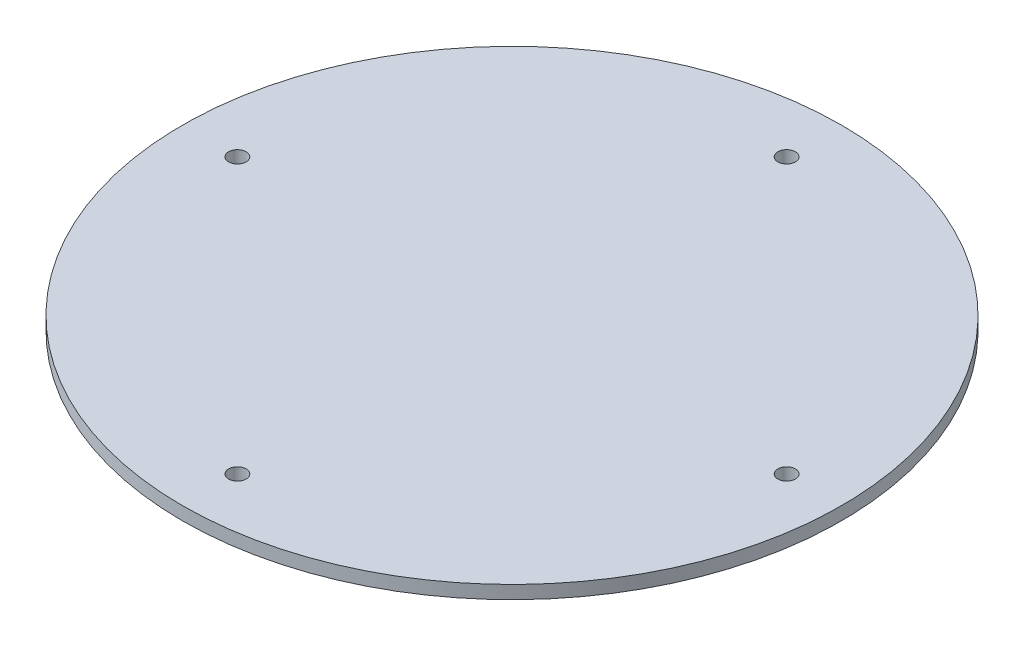
ISO-10303-21;
HEADER;
FILE_DESCRIPTION(('STEP AP214'),'2;1');
FILE_NAME('part.step','',(''),(''),'','','');
FILE_SCHEMA(('AUTOMOTIVE_DESIGN { 1 0 10303 214 1 1 1 1 }'));
ENDSEC;
DATA;
#1=APPLICATION_CONTEXT('core data for automotive mechanical design processes');
#2=APPLICATION_PROTOCOL_DEFINITION('international standard','automotive_design',2000,#1);
#3=PRODUCT_CONTEXT('',#1,'mechanical');
#4=PRODUCT('Part','Part','',(#3));
#5=PRODUCT_RELATED_PRODUCT_CATEGORY('part','',(#4));
#6=PRODUCT_DEFINITION_FORMATION('','',#4);
#7=PRODUCT_DEFINITION_CONTEXT('part definition',#1,'design');
#8=PRODUCT_DEFINITION('design','',#6,#7);
#9=PRODUCT_DEFINITION_SHAPE('','',#8);
#10=(LENGTH_UNIT() NAMED_UNIT(*) SI_UNIT(.MILLI.,.METRE.));
#11=(NAMED_UNIT(*) PLANE_ANGLE_UNIT() SI_UNIT($,.RADIAN.));
#12=(NAMED_UNIT(*) SI_UNIT($,.STERADIAN.) SOLID_ANGLE_UNIT());
#13=UNCERTAINTY_MEASURE_WITH_UNIT(LENGTH_MEASURE(1.E-05),#10,'distance_accuracy_value','');
#14=(GEOMETRIC_REPRESENTATION_CONTEXT(3) GLOBAL_UNCERTAINTY_ASSIGNED_CONTEXT((#13)) GLOBAL_UNIT_ASSIGNED_CONTEXT((#10,
#11,#12)) REPRESENTATION_CONTEXT('',''));
#15=CARTESIAN_POINT('',(0.,0.,0.));
#16=DIRECTION('',(0.,0.,1.));
#17=DIRECTION('',(1.,0.,0.));
#18=AXIS2_PLACEMENT_3D('',#15,#16,#17);
#19=CARTESIAN_POINT('',(0.,3.,0.));
#20=DIRECTION('',(0.,1.,0.));
#21=DIRECTION('',(0.,0.,1.));
#22=AXIS2_PLACEMENT_3D('',#19,#20,#21);
#23=PLANE('',#22);
#24=CARTESIAN_POINT('',(3.52975155131649E-12,3.,62.5));
#25=DIRECTION('',(0.,1.,0.));
#26=DIRECTION('',(0.,0.,1.));
#27=AXIS2_PLACEMENT_3D('',#24,#25,#26);
#28=CIRCLE('',#27,2.00000000000379);
#29=CARTESIAN_POINT('',(3.52975155131649E-12,3.,64.5000000000038));
#30=VERTEX_POINT('',#29);
#31=EDGE_CURVE('E65',#30,#30,#28,.T.);
#32=ORIENTED_EDGE('',*,*,#31,.F.);
#33=EDGE_LOOP('',(#32));
#34=FACE_BOUND('',#33,.T.);
#35=CARTESIAN_POINT('',(0.,3.,-62.5));
#36=DIRECTION('',(0.,1.,0.));
#37=DIRECTION('',(0.,0.,1.));
#38=AXIS2_PLACEMENT_3D('',#35,#36,#37);
#39=CIRCLE('',#38,2.);
#40=CARTESIAN_POINT('',(0.,3.,-60.5));
#41=VERTEX_POINT('',#40);
#42=EDGE_CURVE('E51',#41,#41,#39,.T.);
#43=ORIENTED_EDGE('',*,*,#42,.F.);
#44=EDGE_LOOP('',(#43));
#45=FACE_BOUND('',#44,.T.);
#46=CARTESIAN_POINT('',(0.,3.,0.));
#47=DIRECTION('',(0.,1.,0.));
#48=DIRECTION('',(0.,0.,1.));
#49=AXIS2_PLACEMENT_3D('',#46,#47,#48);
#50=CIRCLE('',#49,75.);
#51=CARTESIAN_POINT('',(0.,3.,75.));
#52=VERTEX_POINT('',#51);
#53=EDGE_CURVE('E10',#52,#52,#50,.T.);
#54=ORIENTED_EDGE('',*,*,#53,.T.);
#55=EDGE_LOOP('',(#54));
#56=FACE_BOUND('',#55,.T.);
#57=CARTESIAN_POINT('',(62.5000000000018,3.,-1.76487577565824E-12));
#58=DIRECTION('',(0.,1.,0.));
#59=DIRECTION('',(0.,0.,1.));
#60=AXIS2_PLACEMENT_3D('',#57,#58,#59);
#61=CIRCLE('',#60,2.00000000000138);
#62=CARTESIAN_POINT('',(62.5000000000018,3.,1.99999999999961));
#63=VERTEX_POINT('',#62);
#64=EDGE_CURVE('E57',#63,#63,#61,.T.);
#65=ORIENTED_EDGE('',*,*,#64,.F.);
#66=EDGE_LOOP('',(#65));
#67=FACE_BOUND('',#66,.T.);
#68=CARTESIAN_POINT('',(-62.4999999999982,3.,1.77252981815291E-12));
#69=DIRECTION('',(0.,1.,0.));
#70=DIRECTION('',(0.,0.,1.));
#71=AXIS2_PLACEMENT_3D('',#68,#69,#70);
#72=CIRCLE('',#71,2.00000000000284);
#73=CARTESIAN_POINT('',(-62.4999999999982,3.,2.00000000000461));
#74=VERTEX_POINT('',#73);
#75=EDGE_CURVE('E73',#74,#74,#72,.T.);
#76=ORIENTED_EDGE('',*,*,#75,.F.);
#77=EDGE_LOOP('',(#76));
#78=FACE_BOUND('',#77,.T.);
#79=ADVANCED_FACE('F38',(#34,#45,#56,#67,#78),#23,.T.);
#80=CARTESIAN_POINT('',(0.,0.,0.));
#81=DIRECTION('',(0.,1.,0.));
#82=DIRECTION('',(0.,0.,1.));
#83=AXIS2_PLACEMENT_3D('',#80,#81,#82);
#84=PLANE('',#83);
#85=CARTESIAN_POINT('',(0.,0.,0.));
#86=DIRECTION('',(0.,1.,0.));
#87=DIRECTION('',(0.,0.,1.));
#88=AXIS2_PLACEMENT_3D('',#85,#86,#87);
#89=CIRCLE('',#88,75.);
#90=CARTESIAN_POINT('',(0.,0.,75.));
#91=VERTEX_POINT('',#90);
#92=EDGE_CURVE('E42',#91,#91,#89,.T.);
#93=ORIENTED_EDGE('',*,*,#92,.F.);
#94=EDGE_LOOP('',(#93));
#95=FACE_BOUND('',#94,.T.);
#96=CARTESIAN_POINT('',(0.,0.,-62.5));
#97=DIRECTION('',(0.,1.,0.));
#98=DIRECTION('',(0.,0.,1.));
#99=AXIS2_PLACEMENT_3D('',#96,#97,#98);
#100=CIRCLE('',#99,2.);
#101=CARTESIAN_POINT('',(0.,0.,-60.5));
#102=VERTEX_POINT('',#101);
#103=EDGE_CURVE('E53',#102,#102,#100,.T.);
#104=ORIENTED_EDGE('',*,*,#103,.T.);
#105=EDGE_LOOP('',(#104));
#106=FACE_BOUND('',#105,.T.);
#107=CARTESIAN_POINT('',(62.5000000000018,0.,-1.76487577565824E-12));
#108=DIRECTION('',(0.,1.,0.));
#109=DIRECTION('',(0.,0.,1.));
#110=AXIS2_PLACEMENT_3D('',#107,#108,#109);
#111=CIRCLE('',#110,2.00000000000138);
#112=CARTESIAN_POINT('',(62.5000000000018,0.,1.99999999999961));
#113=VERTEX_POINT('',#112);
#114=EDGE_CURVE('E61',#113,#113,#111,.T.);
#115=ORIENTED_EDGE('',*,*,#114,.T.);
#116=EDGE_LOOP('',(#115));
#117=FACE_BOUND('',#116,.T.);
#118=CARTESIAN_POINT('',(3.52975155131649E-12,0.,62.5));
#119=DIRECTION('',(0.,1.,0.));
#120=DIRECTION('',(0.,0.,1.));
#121=AXIS2_PLACEMENT_3D('',#118,#119,#120);
#122=CIRCLE('',#121,2.00000000000379);
#123=CARTESIAN_POINT('',(3.52975155131649E-12,0.,64.5000000000038));
#124=VERTEX_POINT('',#123);
#125=EDGE_CURVE('E69',#124,#124,#122,.T.);
#126=ORIENTED_EDGE('',*,*,#125,.T.);
#127=EDGE_LOOP('',(#126));
#128=FACE_BOUND('',#127,.T.);
#129=CARTESIAN_POINT('',(-62.4999999999982,0.,1.77252981815291E-12));
#130=DIRECTION('',(0.,1.,0.));
#131=DIRECTION('',(0.,0.,1.));
#132=AXIS2_PLACEMENT_3D('',#129,#130,#131);
#133=CIRCLE('',#132,2.00000000000284);
#134=CARTESIAN_POINT('',(-62.4999999999982,0.,2.00000000000461));
#135=VERTEX_POINT('',#134);
#136=EDGE_CURVE('E77',#135,#135,#133,.T.);
#137=ORIENTED_EDGE('',*,*,#136,.T.);
#138=EDGE_LOOP('',(#137));
#139=FACE_BOUND('',#138,.T.);
#140=ADVANCED_FACE('F89',(#95,#106,#117,#128,#139),#84,.F.);
#141=CARTESIAN_POINT('',(0.,3.,0.));
#142=DIRECTION('',(0.,-1.,0.));
#143=DIRECTION('',(0.,0.,-1.));
#144=AXIS2_PLACEMENT_3D('',#141,#142,#143);
#145=CYLINDRICAL_SURFACE('',#144,75.);
#146=ORIENTED_EDGE('',*,*,#53,.F.);
#147=EDGE_LOOP('',(#146));
#148=FACE_BOUND('',#147,.T.);
#149=ORIENTED_EDGE('',*,*,#92,.T.);
#150=EDGE_LOOP('',(#149));
#151=FACE_BOUND('',#150,.T.);
#152=ADVANCED_FACE('F40',(#148,#151),#145,.T.);
#153=CARTESIAN_POINT('',(0.,3.,-62.5));
#154=DIRECTION('',(0.,-1.,0.));
#155=DIRECTION('',(0.,0.,-1.));
#156=AXIS2_PLACEMENT_3D('',#153,#154,#155);
#157=CYLINDRICAL_SURFACE('',#156,2.);
#158=ORIENTED_EDGE('',*,*,#42,.T.);
#159=EDGE_LOOP('',(#158));
#160=FACE_BOUND('',#159,.T.);
#161=ORIENTED_EDGE('',*,*,#103,.F.);
#162=EDGE_LOOP('',(#161));
#163=FACE_BOUND('',#162,.T.);
#164=ADVANCED_FACE('F99',(#160,#163),#157,.F.);
#165=CARTESIAN_POINT('',(62.5000000000018,3.,-1.76487577565824E-12));
#166=DIRECTION('',(0.,-1.,0.));
#167=DIRECTION('',(0.,0.,-1.));
#168=AXIS2_PLACEMENT_3D('',#165,#166,#167);
#169=CYLINDRICAL_SURFACE('',#168,2.00000000000138);
#170=ORIENTED_EDGE('',*,*,#64,.T.);
#171=EDGE_LOOP('',(#170));
#172=FACE_BOUND('',#171,.T.);
#173=ORIENTED_EDGE('',*,*,#114,.F.);
#174=EDGE_LOOP('',(#173));
#175=FACE_BOUND('',#174,.T.);
#176=ADVANCED_FACE('F102',(#172,#175),#169,.F.);
#177=CARTESIAN_POINT('',(3.52975155131649E-12,3.,62.5));
#178=DIRECTION('',(0.,-1.,0.));
#179=DIRECTION('',(0.,0.,-1.));
#180=AXIS2_PLACEMENT_3D('',#177,#178,#179);
#181=CYLINDRICAL_SURFACE('',#180,2.00000000000379);
#182=ORIENTED_EDGE('',*,*,#31,.T.);
#183=EDGE_LOOP('',(#182));
#184=FACE_BOUND('',#183,.T.);
#185=ORIENTED_EDGE('',*,*,#125,.F.);
#186=EDGE_LOOP('',(#185));
#187=FACE_BOUND('',#186,.T.);
#188=ADVANCED_FACE('F106',(#184,#187),#181,.F.);
#189=CARTESIAN_POINT('',(-62.4999999999982,3.,1.77252981815291E-12));
#190=DIRECTION('',(0.,-1.,0.));
#191=DIRECTION('',(0.,0.,-1.));
#192=AXIS2_PLACEMENT_3D('',#189,#190,#191);
#193=CYLINDRICAL_SURFACE('',#192,2.00000000000284);
#194=ORIENTED_EDGE('',*,*,#75,.T.);
#195=EDGE_LOOP('',(#194));
#196=FACE_BOUND('',#195,.T.);
#197=ORIENTED_EDGE('',*,*,#136,.F.);
#198=EDGE_LOOP('',(#197));
#199=FACE_BOUND('',#198,.T.);
#200=ADVANCED_FACE('F85',(#196,#199),#193,.F.);
#201=CLOSED_SHELL('',(#79,#140,#152,#164,#176,#188,#200));
#202=MANIFOLD_SOLID_BREP('B2',#201);
#203=ADVANCED_BREP_SHAPE_REPRESENTATION('',(#18,#202),#14);
#204=SHAPE_DEFINITION_REPRESENTATION(#9,#203);
ENDSEC;
END-ISO-10303-21;
